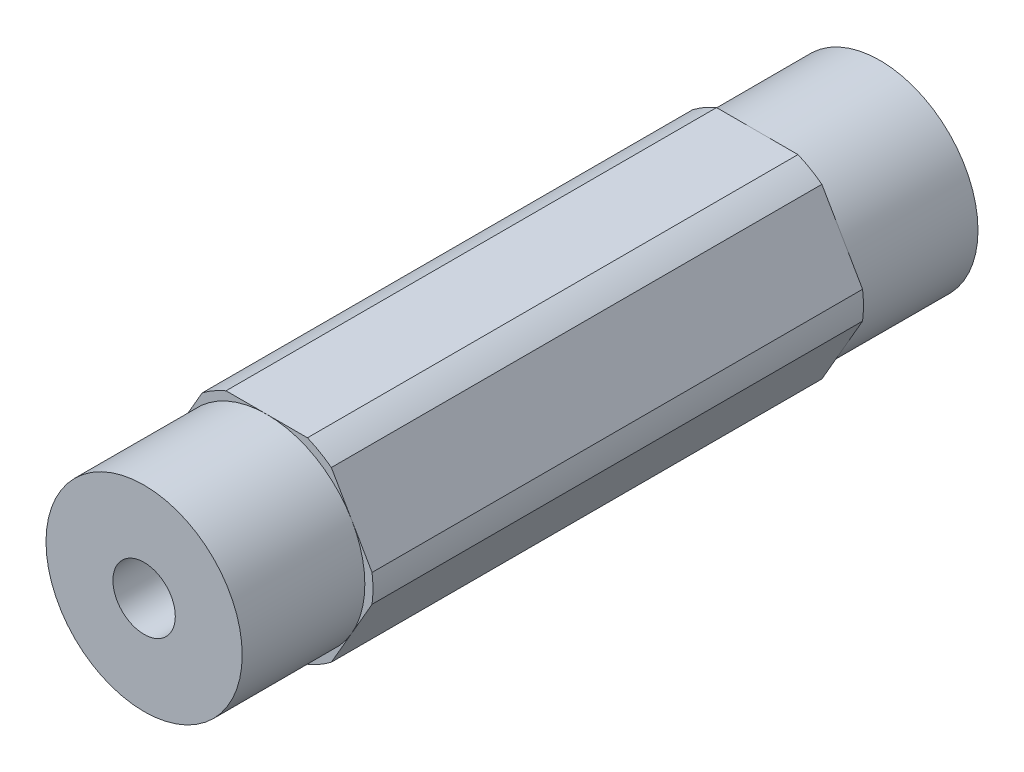
ISO-10303-21;
HEADER;
FILE_DESCRIPTION(('STEP AP214'),'2;1');
FILE_NAME('part.step','',(''),(''),'','','');
FILE_SCHEMA(('AUTOMOTIVE_DESIGN { 1 0 10303 214 1 1 1 1 }'));
ENDSEC;
DATA;
#1=APPLICATION_CONTEXT('core data for automotive mechanical design processes');
#2=APPLICATION_PROTOCOL_DEFINITION('international standard','automotive_design',2000,#1);
#3=PRODUCT_CONTEXT('',#1,'mechanical');
#4=PRODUCT('Part','Part','',(#3));
#5=PRODUCT_RELATED_PRODUCT_CATEGORY('part','',(#4));
#6=PRODUCT_DEFINITION_FORMATION('','',#4);
#7=PRODUCT_DEFINITION_CONTEXT('part definition',#1,'design');
#8=PRODUCT_DEFINITION('design','',#6,#7);
#9=PRODUCT_DEFINITION_SHAPE('','',#8);
#10=(LENGTH_UNIT() NAMED_UNIT(*) SI_UNIT(.MILLI.,.METRE.));
#11=(NAMED_UNIT(*) PLANE_ANGLE_UNIT() SI_UNIT($,.RADIAN.));
#12=(NAMED_UNIT(*) SI_UNIT($,.STERADIAN.) SOLID_ANGLE_UNIT());
#13=UNCERTAINTY_MEASURE_WITH_UNIT(LENGTH_MEASURE(1.E-05),#10,'distance_accuracy_value','');
#14=(GEOMETRIC_REPRESENTATION_CONTEXT(3) GLOBAL_UNCERTAINTY_ASSIGNED_CONTEXT((#13)) GLOBAL_UNIT_ASSIGNED_CONTEXT((#10,
#11,#12)) REPRESENTATION_CONTEXT('',''));
#15=CARTESIAN_POINT('',(0.,0.,0.));
#16=DIRECTION('',(0.,0.,1.));
#17=DIRECTION('',(1.,0.,0.));
#18=AXIS2_PLACEMENT_3D('',#15,#16,#17);
#19=CARTESIAN_POINT('',(5.58474434298441,3.22435364977729,23.8125));
#20=DIRECTION('',(-0.866025403784439,-0.5,0.));
#21=DIRECTION('',(0.5,-0.866025403784439,0.));
#22=AXIS2_PLACEMENT_3D('',#19,#20,#21);
#23=PLANE('',#22);
#24=DIRECTION('',(0.5,-0.866025403784439,0.));
#25=VECTOR('',#24,1.);
#26=CARTESIAN_POINT('',(5.58474434298441,3.22435364977729,-15.875));
#27=LINE('',#26,#25);
#28=CARTESIAN_POINT('',(15.2942708460865,-13.5930395710322,-15.875));
#29=VERTEX_POINT('',#28);
#30=CARTESIAN_POINT('',(16.6117613140312,-15.875,-15.875));
#31=VERTEX_POINT('',#30);
#32=EDGE_CURVE('E167',#29,#31,#27,.T.);
#33=ORIENTED_EDGE('',*,*,#32,.F.);
#34=DIRECTION('',(0.,0.,-1.));
#35=VECTOR('',#34,1.);
#36=CARTESIAN_POINT('',(15.2942708460865,-13.5930395710322,23.8125));
#37=LINE('',#36,#35);
#38=CARTESIAN_POINT('',(15.2942708460865,-13.5930395710322,15.875));
#39=VERTEX_POINT('',#38);
#40=EDGE_CURVE('E291',#39,#29,#37,.T.);
#41=ORIENTED_EDGE('',*,*,#40,.F.);
#42=DIRECTION('',(-0.5,0.866025403784439,0.));
#43=VECTOR('',#42,1.);
#44=CARTESIAN_POINT('',(5.58474434298441,3.22435364977729,15.875));
#45=LINE('',#44,#43);
#46=CARTESIAN_POINT('',(16.6117613140312,-15.875,15.875));
#47=VERTEX_POINT('',#46);
#48=EDGE_CURVE('E251',#47,#39,#45,.T.);
#49=ORIENTED_EDGE('',*,*,#48,.F.);
#50=CARTESIAN_POINT('',(17.9292517819758,-18.1569604289678,15.875));
#51=VERTEX_POINT('',#50);
#52=EDGE_CURVE('E253',#51,#47,#45,.T.);
#53=ORIENTED_EDGE('',*,*,#52,.F.);
#54=DIRECTION('',(0.,0.,-1.));
#55=VECTOR('',#54,1.);
#56=CARTESIAN_POINT('',(17.9292517819758,-18.1569604289678,23.8125));
#57=LINE('',#56,#55);
#58=CARTESIAN_POINT('',(17.9292517819758,-18.1569604289678,-15.875));
#59=VERTEX_POINT('',#58);
#60=EDGE_CURVE('E198',#51,#59,#57,.T.);
#61=ORIENTED_EDGE('',*,*,#60,.T.);
#62=EDGE_CURVE('E55',#31,#59,#27,.T.);
#63=ORIENTED_EDGE('',*,*,#62,.F.);
#64=EDGE_LOOP('',(#33,#41,#49,#53,#61,#63));
#65=FACE_BOUND('',#64,.T.);
#66=ADVANCED_FACE('F41',(#65),#23,.F.);
#67=CARTESIAN_POINT('',(11.1125,-19.05,23.8125));
#68=DIRECTION('',(0.,0.,-1.));
#69=DIRECTION('',(-1.,0.,0.));
#70=AXIS2_PLACEMENT_3D('',#67,#68,#69);
#71=CYLINDRICAL_SURFACE('',#70,6.874999966);
#72=CARTESIAN_POINT('',(11.1125,-19.05,-15.875));
#73=DIRECTION('',(0.,0.,-1.));
#74=DIRECTION('',(-1.,0.,0.));
#75=AXIS2_PLACEMENT_3D('',#72,#73,#74);
#76=CIRCLE('',#75,6.874999966);
#77=CARTESIAN_POINT('',(13.7474809358893,-12.7,-15.875));
#78=VERTEX_POINT('',#77);
#79=EDGE_CURVE('E173',#78,#29,#76,.T.);
#80=ORIENTED_EDGE('',*,*,#79,.F.);
#81=DIRECTION('',(0.,0.,-1.));
#82=VECTOR('',#81,1.);
#83=CARTESIAN_POINT('',(13.7474809358893,-12.7,23.8125));
#84=LINE('',#83,#82);
#85=CARTESIAN_POINT('',(13.7474809358893,-12.7,15.875));
#86=VERTEX_POINT('',#85);
#87=EDGE_CURVE('E288',#86,#78,#84,.T.);
#88=ORIENTED_EDGE('',*,*,#87,.F.);
#89=CARTESIAN_POINT('',(11.1125,-19.05,15.875));
#90=DIRECTION('',(0.,0.,1.));
#91=DIRECTION('',(1.,0.,0.));
#92=AXIS2_PLACEMENT_3D('',#89,#90,#91);
#93=CIRCLE('',#92,6.874999966);
#94=EDGE_CURVE('E249',#39,#86,#93,.T.);
#95=ORIENTED_EDGE('',*,*,#94,.F.);
#96=ORIENTED_EDGE('',*,*,#40,.T.);
#97=EDGE_LOOP('',(#80,#88,#95,#96));
#98=FACE_BOUND('',#97,.T.);
#99=ADVANCED_FACE('F310',(#98),#71,.T.);
#100=CARTESIAN_POINT('',(0.,-12.7,23.8125));
#101=DIRECTION('',(0.,-1.,0.));
#102=DIRECTION('',(0.,0.,-1.));
#103=AXIS2_PLACEMENT_3D('',#100,#101,#102);
#104=PLANE('',#103);
#105=DIRECTION('',(1.,0.,0.));
#106=VECTOR('',#105,1.);
#107=CARTESIAN_POINT('',(0.,-12.7,-15.875));
#108=LINE('',#107,#106);
#109=CARTESIAN_POINT('',(8.4775190641107,-12.7,-15.875));
#110=VERTEX_POINT('',#109);
#111=CARTESIAN_POINT('',(11.1125,-12.7,-15.875));
#112=VERTEX_POINT('',#111);
#113=EDGE_CURVE('E214',#110,#112,#108,.T.);
#114=ORIENTED_EDGE('',*,*,#113,.F.);
#115=DIRECTION('',(0.,0.,-1.));
#116=VECTOR('',#115,1.);
#117=CARTESIAN_POINT('',(8.4775190641107,-12.7,23.8125));
#118=LINE('',#117,#116);
#119=CARTESIAN_POINT('',(8.4775190641107,-12.7,15.875));
#120=VERTEX_POINT('',#119);
#121=EDGE_CURVE('E285',#120,#110,#118,.T.);
#122=ORIENTED_EDGE('',*,*,#121,.F.);
#123=DIRECTION('',(-1.,0.,0.));
#124=VECTOR('',#123,1.);
#125=CARTESIAN_POINT('',(0.,-12.7,15.875));
#126=LINE('',#125,#124);
#127=CARTESIAN_POINT('',(11.1125,-12.7,15.875));
#128=VERTEX_POINT('',#127);
#129=EDGE_CURVE('E246',#128,#120,#126,.T.);
#130=ORIENTED_EDGE('',*,*,#129,.F.);
#131=EDGE_CURVE('E248',#86,#128,#126,.T.);
#132=ORIENTED_EDGE('',*,*,#131,.F.);
#133=ORIENTED_EDGE('',*,*,#87,.T.);
#134=EDGE_CURVE('E211',#112,#78,#108,.T.);
#135=ORIENTED_EDGE('',*,*,#134,.F.);
#136=EDGE_LOOP('',(#114,#122,#130,#132,#133,#135));
#137=FACE_BOUND('',#136,.T.);
#138=ADVANCED_FACE('F314',(#137),#104,.F.);
#139=CARTESIAN_POINT('',(11.1125,-19.05,-15.875));
#140=DIRECTION('',(0.,0.,-1.));
#141=DIRECTION('',(-1.,0.,0.));
#142=AXIS2_PLACEMENT_3D('',#139,#140,#141);
#143=CIRCLE('',#142,6.874999966);
#144=CARTESIAN_POINT('',(6.93072915391346,-13.5930395710322,-15.875));
#145=VERTEX_POINT('',#144);
#146=EDGE_CURVE('E219',#145,#110,#143,.T.);
#147=ORIENTED_EDGE('',*,*,#146,.F.);
#148=DIRECTION('',(0.,0.,-1.));
#149=VECTOR('',#148,1.);
#150=CARTESIAN_POINT('',(6.93072915391346,-13.5930395710322,23.8125));
#151=LINE('',#150,#149);
#152=CARTESIAN_POINT('',(6.93072915391346,-13.5930395710322,15.875));
#153=VERTEX_POINT('',#152);
#154=EDGE_CURVE('E282',#153,#145,#151,.T.);
#155=ORIENTED_EDGE('',*,*,#154,.F.);
#156=CARTESIAN_POINT('',(11.1125,-19.05,15.875));
#157=DIRECTION('',(0.,0.,1.));
#158=DIRECTION('',(1.,0.,0.));
#159=AXIS2_PLACEMENT_3D('',#156,#157,#158);
#160=CIRCLE('',#159,6.874999966);
#161=EDGE_CURVE('E244',#120,#153,#160,.T.);
#162=ORIENTED_EDGE('',*,*,#161,.F.);
#163=ORIENTED_EDGE('',*,*,#121,.T.);
#164=EDGE_LOOP('',(#147,#155,#162,#163));
#165=FACE_BOUND('',#164,.T.);
#166=ADVANCED_FACE('F317',(#165),#71,.T.);
#167=CARTESIAN_POINT('',(11.0840056570156,-6.39935364977728,23.8125));
#168=DIRECTION('',(0.866025403784439,-0.5,0.));
#169=DIRECTION('',(0.5,0.866025403784439,0.));
#170=AXIS2_PLACEMENT_3D('',#167,#168,#169);
#171=PLANE('',#170);
#172=DIRECTION('',(0.5,0.866025403784439,0.));
#173=VECTOR('',#172,1.);
#174=CARTESIAN_POINT('',(11.0840056570156,-6.39935364977728,-15.875));
#175=LINE('',#174,#173);
#176=CARTESIAN_POINT('',(4.29574821802417,-18.1569604289678,-15.875));
#177=VERTEX_POINT('',#176);
#178=CARTESIAN_POINT('',(5.61323868596881,-15.875,-15.875));
#179=VERTEX_POINT('',#178);
#180=EDGE_CURVE('E217',#177,#179,#175,.T.);
#181=ORIENTED_EDGE('',*,*,#180,.F.);
#182=DIRECTION('',(0.,0.,-1.));
#183=VECTOR('',#182,1.);
#184=CARTESIAN_POINT('',(4.29574821802417,-18.1569604289678,23.8125));
#185=LINE('',#184,#183);
#186=CARTESIAN_POINT('',(4.29574821802417,-18.1569604289678,15.875));
#187=VERTEX_POINT('',#186);
#188=EDGE_CURVE('E279',#187,#177,#185,.T.);
#189=ORIENTED_EDGE('',*,*,#188,.F.);
#190=DIRECTION('',(-0.5,-0.866025403784439,0.));
#191=VECTOR('',#190,1.);
#192=CARTESIAN_POINT('',(11.0840056570156,-6.39935364977728,15.875));
#193=LINE('',#192,#191);
#194=CARTESIAN_POINT('',(5.61323868596881,-15.875,15.875));
#195=VERTEX_POINT('',#194);
#196=EDGE_CURVE('E241',#195,#187,#193,.T.);
#197=ORIENTED_EDGE('',*,*,#196,.F.);
#198=EDGE_CURVE('E243',#153,#195,#193,.T.);
#199=ORIENTED_EDGE('',*,*,#198,.F.);
#200=ORIENTED_EDGE('',*,*,#154,.T.);
#201=EDGE_CURVE('E220',#179,#145,#175,.T.);
#202=ORIENTED_EDGE('',*,*,#201,.F.);
#203=EDGE_LOOP('',(#181,#189,#197,#199,#200,#202));
#204=FACE_BOUND('',#203,.T.);
#205=ADVANCED_FACE('F323',(#204),#171,.F.);
#206=CARTESIAN_POINT('',(11.1125,-19.05,-15.875));
#207=DIRECTION('',(0.,0.,-1.));
#208=DIRECTION('',(-1.,0.,0.));
#209=AXIS2_PLACEMENT_3D('',#206,#207,#208);
#210=CIRCLE('',#209,6.874999966);
#211=CARTESIAN_POINT('',(4.29574821802416,-19.9430395710322,-15.875));
#212=VERTEX_POINT('',#211);
#213=EDGE_CURVE('E215',#212,#177,#210,.T.);
#214=ORIENTED_EDGE('',*,*,#213,.F.);
#215=DIRECTION('',(0.,0.,-1.));
#216=VECTOR('',#215,1.);
#217=CARTESIAN_POINT('',(4.29574821802417,-19.9430395710322,23.8125));
#218=LINE('',#217,#216);
#219=CARTESIAN_POINT('',(4.29574821802416,-19.9430395710322,15.875));
#220=VERTEX_POINT('',#219);
#221=EDGE_CURVE('E276',#220,#212,#218,.T.);
#222=ORIENTED_EDGE('',*,*,#221,.F.);
#223=CARTESIAN_POINT('',(11.1125,-19.05,15.875));
#224=DIRECTION('',(0.,0.,1.));
#225=DIRECTION('',(1.,0.,0.));
#226=AXIS2_PLACEMENT_3D('',#223,#224,#225);
#227=CIRCLE('',#226,6.874999966);
#228=EDGE_CURVE('E239',#187,#220,#227,.T.);
#229=ORIENTED_EDGE('',*,*,#228,.F.);
#230=ORIENTED_EDGE('',*,*,#188,.T.);
#231=EDGE_LOOP('',(#214,#222,#229,#230));
#232=FACE_BOUND('',#231,.T.);
#233=ADVANCED_FACE('F326',(#232),#71,.T.);
#234=CARTESIAN_POINT('',(-5.41377828507796,-3.12564635022271,23.8125));
#235=DIRECTION('',(0.866025403784439,0.5,0.));
#236=DIRECTION('',(-0.5,0.866025403784439,0.));
#237=AXIS2_PLACEMENT_3D('',#234,#235,#236);
#238=PLANE('',#237);
#239=DIRECTION('',(-0.5,0.866025403784439,0.));
#240=VECTOR('',#239,1.);
#241=CARTESIAN_POINT('',(-5.41377828507796,-3.12564635022271,-15.875));
#242=LINE('',#241,#240);
#243=CARTESIAN_POINT('',(6.93072915391346,-24.5069604289678,-15.875));
#244=VERTEX_POINT('',#243);
#245=CARTESIAN_POINT('',(5.61323868596881,-22.225,-15.875));
#246=VERTEX_POINT('',#245);
#247=EDGE_CURVE('E209',#244,#246,#242,.T.);
#248=ORIENTED_EDGE('',*,*,#247,.F.);
#249=DIRECTION('',(0.,0.,-1.));
#250=VECTOR('',#249,1.);
#251=CARTESIAN_POINT('',(6.93072915391346,-24.5069604289678,23.8125));
#252=LINE('',#251,#250);
#253=CARTESIAN_POINT('',(6.93072915391346,-24.5069604289678,15.875));
#254=VERTEX_POINT('',#253);
#255=EDGE_CURVE('E273',#254,#244,#252,.T.);
#256=ORIENTED_EDGE('',*,*,#255,.F.);
#257=DIRECTION('',(0.5,-0.866025403784439,0.));
#258=VECTOR('',#257,1.);
#259=CARTESIAN_POINT('',(-5.41377828507796,-3.12564635022271,15.875));
#260=LINE('',#259,#258);
#261=CARTESIAN_POINT('',(5.61323868596881,-22.225,15.875));
#262=VERTEX_POINT('',#261);
#263=EDGE_CURVE('E236',#262,#254,#260,.T.);
#264=ORIENTED_EDGE('',*,*,#263,.F.);
#265=EDGE_CURVE('E238',#220,#262,#260,.T.);
#266=ORIENTED_EDGE('',*,*,#265,.F.);
#267=ORIENTED_EDGE('',*,*,#221,.T.);
#268=EDGE_CURVE('E212',#246,#212,#242,.T.);
#269=ORIENTED_EDGE('',*,*,#268,.F.);
#270=EDGE_LOOP('',(#248,#256,#264,#266,#267,#269));
#271=FACE_BOUND('',#270,.T.);
#272=ADVANCED_FACE('F328',(#271),#238,.F.);
#273=CARTESIAN_POINT('',(11.1125,-19.05,-15.875));
#274=DIRECTION('',(0.,0.,-1.));
#275=DIRECTION('',(-1.,0.,0.));
#276=AXIS2_PLACEMENT_3D('',#273,#274,#275);
#277=CIRCLE('',#276,6.874999966);
#278=CARTESIAN_POINT('',(8.47751906411071,-25.4,-15.875));
#279=VERTEX_POINT('',#278);
#280=EDGE_CURVE('E207',#279,#244,#277,.T.);
#281=ORIENTED_EDGE('',*,*,#280,.F.);
#282=DIRECTION('',(0.,0.,-1.));
#283=VECTOR('',#282,1.);
#284=CARTESIAN_POINT('',(8.47751906411071,-25.4,23.8125));
#285=LINE('',#284,#283);
#286=CARTESIAN_POINT('',(8.47751906411071,-25.4,15.875));
#287=VERTEX_POINT('',#286);
#288=EDGE_CURVE('E270',#287,#279,#285,.T.);
#289=ORIENTED_EDGE('',*,*,#288,.F.);
#290=CARTESIAN_POINT('',(11.1125,-19.05,15.875));
#291=DIRECTION('',(0.,0.,1.));
#292=DIRECTION('',(1.,0.,0.));
#293=AXIS2_PLACEMENT_3D('',#290,#291,#292);
#294=CIRCLE('',#293,6.874999966);
#295=EDGE_CURVE('E234',#254,#287,#294,.T.);
#296=ORIENTED_EDGE('',*,*,#295,.F.);
#297=ORIENTED_EDGE('',*,*,#255,.T.);
#298=EDGE_LOOP('',(#281,#289,#296,#297));
#299=FACE_BOUND('',#298,.T.);
#300=ADVANCED_FACE('F331',(#299),#71,.T.);
#301=CARTESIAN_POINT('',(0.,-25.4,23.8125));
#302=DIRECTION('',(0.,1.,0.));
#303=DIRECTION('',(0.,0.,1.));
#304=AXIS2_PLACEMENT_3D('',#301,#302,#303);
#305=PLANE('',#304);
#306=DIRECTION('',(-1.,0.,0.));
#307=VECTOR('',#306,1.);
#308=CARTESIAN_POINT('',(0.,-25.4,-15.875));
#309=LINE('',#308,#307);
#310=CARTESIAN_POINT('',(13.7474809358893,-25.4,-15.875));
#311=VERTEX_POINT('',#310);
#312=CARTESIAN_POINT('',(11.1125,-25.4,-15.875));
#313=VERTEX_POINT('',#312);
#314=EDGE_CURVE('E203',#311,#313,#309,.T.);
#315=ORIENTED_EDGE('',*,*,#314,.F.);
#316=DIRECTION('',(0.,0.,-1.));
#317=VECTOR('',#316,1.);
#318=CARTESIAN_POINT('',(13.7474809358893,-25.4,23.8125));
#319=LINE('',#318,#317);
#320=CARTESIAN_POINT('',(13.7474809358893,-25.4,15.875));
#321=VERTEX_POINT('',#320);
#322=EDGE_CURVE('E267',#321,#311,#319,.T.);
#323=ORIENTED_EDGE('',*,*,#322,.F.);
#324=DIRECTION('',(1.,0.,0.));
#325=VECTOR('',#324,1.);
#326=CARTESIAN_POINT('',(0.,-25.4,15.875));
#327=LINE('',#326,#325);
#328=CARTESIAN_POINT('',(11.1125,-25.4,15.875));
#329=VERTEX_POINT('',#328);
#330=EDGE_CURVE('E231',#329,#321,#327,.T.);
#331=ORIENTED_EDGE('',*,*,#330,.F.);
#332=EDGE_CURVE('E233',#287,#329,#327,.T.);
#333=ORIENTED_EDGE('',*,*,#332,.F.);
#334=ORIENTED_EDGE('',*,*,#288,.T.);
#335=EDGE_CURVE('E205',#313,#279,#309,.T.);
#336=ORIENTED_EDGE('',*,*,#335,.F.);
#337=EDGE_LOOP('',(#315,#323,#331,#333,#334,#336));
#338=FACE_BOUND('',#337,.T.);
#339=ADVANCED_FACE('F333',(#338),#305,.F.);
#340=CARTESIAN_POINT('',(11.1125,-19.05,-15.875));
#341=DIRECTION('',(0.,0.,-1.));
#342=DIRECTION('',(-1.,0.,0.));
#343=AXIS2_PLACEMENT_3D('',#340,#341,#342);
#344=CIRCLE('',#343,6.874999966);
#345=CARTESIAN_POINT('',(15.2942708460865,-24.5069604289678,-15.875));
#346=VERTEX_POINT('',#345);
#347=EDGE_CURVE('E201',#346,#311,#344,.T.);
#348=ORIENTED_EDGE('',*,*,#347,.F.);
#349=DIRECTION('',(0.,0.,-1.));
#350=VECTOR('',#349,1.);
#351=CARTESIAN_POINT('',(15.2942708460866,-24.5069604289678,23.8125));
#352=LINE('',#351,#350);
#353=CARTESIAN_POINT('',(15.2942708460865,-24.5069604289678,15.875));
#354=VERTEX_POINT('',#353);
#355=EDGE_CURVE('E264',#354,#346,#352,.T.);
#356=ORIENTED_EDGE('',*,*,#355,.F.);
#357=CARTESIAN_POINT('',(11.1125,-19.05,15.875));
#358=DIRECTION('',(0.,0.,1.));
#359=DIRECTION('',(1.,0.,0.));
#360=AXIS2_PLACEMENT_3D('',#357,#358,#359);
#361=CIRCLE('',#360,6.874999966);
#362=EDGE_CURVE('E229',#321,#354,#361,.T.);
#363=ORIENTED_EDGE('',*,*,#362,.F.);
#364=ORIENTED_EDGE('',*,*,#322,.T.);
#365=EDGE_LOOP('',(#348,#356,#363,#364));
#366=FACE_BOUND('',#365,.T.);
#367=ADVANCED_FACE('F336',(#366),#71,.T.);
#368=CARTESIAN_POINT('',(22.082528285078,-12.7493536497773,23.8125));
#369=DIRECTION('',(-0.866025403784439,0.499999999999999,0.));
#370=DIRECTION('',(-0.499999999999999,-0.866025403784439,0.));
#371=AXIS2_PLACEMENT_3D('',#368,#369,#370);
#372=PLANE('',#371);
#373=DIRECTION('',(-0.499999999999999,-0.866025403784439,0.));
#374=VECTOR('',#373,1.);
#375=CARTESIAN_POINT('',(22.082528285078,-12.7493536497773,-15.875));
#376=LINE('',#375,#374);
#377=CARTESIAN_POINT('',(17.9292517819758,-19.9430395710322,-15.875));
#378=VERTEX_POINT('',#377);
#379=CARTESIAN_POINT('',(16.6117613140312,-22.225,-15.875));
#380=VERTEX_POINT('',#379);
#381=EDGE_CURVE('E183',#378,#380,#376,.T.);
#382=ORIENTED_EDGE('',*,*,#381,.F.);
#383=DIRECTION('',(0.,0.,-1.));
#384=VECTOR('',#383,1.);
#385=CARTESIAN_POINT('',(17.9292517819758,-19.9430395710322,23.8125));
#386=LINE('',#385,#384);
#387=CARTESIAN_POINT('',(17.9292517819758,-19.9430395710322,15.875));
#388=VERTEX_POINT('',#387);
#389=EDGE_CURVE('E261',#388,#378,#386,.T.);
#390=ORIENTED_EDGE('',*,*,#389,.F.);
#391=DIRECTION('',(0.499999999999999,0.866025403784439,0.));
#392=VECTOR('',#391,1.);
#393=CARTESIAN_POINT('',(22.082528285078,-12.7493536497773,15.875));
#394=LINE('',#393,#392);
#395=CARTESIAN_POINT('',(16.6117613140312,-22.225,15.875));
#396=VERTEX_POINT('',#395);
#397=EDGE_CURVE('E63',#396,#388,#394,.T.);
#398=ORIENTED_EDGE('',*,*,#397,.F.);
#399=EDGE_CURVE('E228',#354,#396,#394,.T.);
#400=ORIENTED_EDGE('',*,*,#399,.F.);
#401=ORIENTED_EDGE('',*,*,#355,.T.);
#402=EDGE_CURVE('E177',#380,#346,#376,.T.);
#403=ORIENTED_EDGE('',*,*,#402,.F.);
#404=EDGE_LOOP('',(#382,#390,#398,#400,#401,#403));
#405=FACE_BOUND('',#404,.T.);
#406=ADVANCED_FACE('F338',(#405),#372,.F.);
#407=CARTESIAN_POINT('',(11.1125,-19.05,-15.875));
#408=DIRECTION('',(0.,0.,-1.));
#409=DIRECTION('',(-1.,0.,0.));
#410=AXIS2_PLACEMENT_3D('',#407,#408,#409);
#411=CIRCLE('',#410,6.874999966);
#412=EDGE_CURVE('E12',#59,#378,#411,.T.);
#413=ORIENTED_EDGE('',*,*,#412,.F.);
#414=ORIENTED_EDGE('',*,*,#60,.F.);
#415=CARTESIAN_POINT('',(11.1125,-19.05,15.875));
#416=DIRECTION('',(0.,0.,1.));
#417=DIRECTION('',(1.,0.,0.));
#418=AXIS2_PLACEMENT_3D('',#415,#416,#417);
#419=CIRCLE('',#418,6.874999966);
#420=EDGE_CURVE('E296',#388,#51,#419,.T.);
#421=ORIENTED_EDGE('',*,*,#420,.F.);
#422=ORIENTED_EDGE('',*,*,#389,.T.);
#423=EDGE_LOOP('',(#413,#414,#421,#422));
#424=FACE_BOUND('',#423,.T.);
#425=ADVANCED_FACE('F318',(#424),#71,.T.);
#426=CARTESIAN_POINT('',(0.,0.,-23.8125));
#427=DIRECTION('',(0.,0.,1.));
#428=DIRECTION('',(1.,0.,0.));
#429=AXIS2_PLACEMENT_3D('',#426,#427,#428);
#430=PLANE('',#429);
#431=CARTESIAN_POINT('',(11.1125,-19.05,-23.8125));
#432=DIRECTION('',(0.,0.,1.));
#433=DIRECTION('',(1.,0.,0.));
#434=AXIS2_PLACEMENT_3D('',#431,#432,#433);
#435=CIRCLE('',#434,2.0193);
#436=CARTESIAN_POINT('',(13.1318,-19.05,-23.8125));
#437=VERTEX_POINT('',#436);
#438=EDGE_CURVE('E257',#437,#437,#435,.T.);
#439=ORIENTED_EDGE('',*,*,#438,.T.);
#440=EDGE_LOOP('',(#439));
#441=FACE_BOUND('',#440,.T.);
#442=CARTESIAN_POINT('',(11.1125,-19.05,-23.8125));
#443=DIRECTION('',(0.,0.,1.));
#444=DIRECTION('',(1.,0.,0.));
#445=AXIS2_PLACEMENT_3D('',#442,#443,#444);
#446=CIRCLE('',#445,6.35);
#447=CARTESIAN_POINT('',(17.4625,-19.05,-23.8125));
#448=VERTEX_POINT('',#447);
#449=EDGE_CURVE('E49',#448,#448,#446,.F.);
#450=ORIENTED_EDGE('',*,*,#449,.T.);
#451=EDGE_LOOP('',(#450));
#452=FACE_BOUND('',#451,.T.);
#453=ADVANCED_FACE('F300',(#441,#452),#430,.F.);
#454=CARTESIAN_POINT('',(0.,0.,23.8125));
#455=DIRECTION('',(0.,0.,1.));
#456=DIRECTION('',(1.,0.,0.));
#457=AXIS2_PLACEMENT_3D('',#454,#455,#456);
#458=PLANE('',#457);
#459=CARTESIAN_POINT('',(11.1125,-19.05,23.8125));
#460=DIRECTION('',(0.,0.,1.));
#461=DIRECTION('',(1.,0.,0.));
#462=AXIS2_PLACEMENT_3D('',#459,#460,#461);
#463=CIRCLE('',#462,2.0193);
#464=CARTESIAN_POINT('',(13.1318,-19.05,23.8125));
#465=VERTEX_POINT('',#464);
#466=EDGE_CURVE('E254',#465,#465,#463,.T.);
#467=ORIENTED_EDGE('',*,*,#466,.F.);
#468=EDGE_LOOP('',(#467));
#469=FACE_BOUND('',#468,.T.);
#470=CARTESIAN_POINT('',(11.1125,-19.05,23.8125));
#471=DIRECTION('',(0.,0.,1.));
#472=DIRECTION('',(1.,0.,0.));
#473=AXIS2_PLACEMENT_3D('',#470,#471,#472);
#474=CIRCLE('',#473,6.35);
#475=CARTESIAN_POINT('',(17.4625,-19.05,23.8125));
#476=VERTEX_POINT('',#475);
#477=EDGE_CURVE('E293',#476,#476,#474,.T.);
#478=ORIENTED_EDGE('',*,*,#477,.T.);
#479=EDGE_LOOP('',(#478));
#480=FACE_BOUND('',#479,.T.);
#481=ADVANCED_FACE('F344',(#469,#480),#458,.T.);
#482=CARTESIAN_POINT('',(11.1125,-19.05,23.8125));
#483=DIRECTION('',(0.,0.,-1.));
#484=DIRECTION('',(-1.,0.,0.));
#485=AXIS2_PLACEMENT_3D('',#482,#483,#484);
#486=CYLINDRICAL_SURFACE('',#485,2.0193);
#487=ORIENTED_EDGE('',*,*,#466,.T.);
#488=EDGE_LOOP('',(#487));
#489=FACE_BOUND('',#488,.T.);
#490=ORIENTED_EDGE('',*,*,#438,.F.);
#491=EDGE_LOOP('',(#490));
#492=FACE_BOUND('',#491,.T.);
#493=ADVANCED_FACE('F43',(#489,#492),#486,.F.);
#494=CARTESIAN_POINT('',(11.1125,-19.05,15.875));
#495=DIRECTION('',(0.,0.,1.));
#496=DIRECTION('',(1.,0.,0.));
#497=AXIS2_PLACEMENT_3D('',#494,#495,#496);
#498=PLANE('',#497);
#499=ORIENTED_EDGE('',*,*,#52,.T.);
#500=CARTESIAN_POINT('',(11.1125,-19.05,15.875));
#501=DIRECTION('',(0.,0.,1.));
#502=DIRECTION('',(1.,0.,0.));
#503=AXIS2_PLACEMENT_3D('',#500,#501,#502);
#504=CIRCLE('',#503,6.35);
#505=EDGE_CURVE('E226',#396,#47,#504,.T.);
#506=ORIENTED_EDGE('',*,*,#505,.F.);
#507=ORIENTED_EDGE('',*,*,#397,.T.);
#508=ORIENTED_EDGE('',*,*,#420,.T.);
#509=EDGE_LOOP('',(#499,#506,#507,#508));
#510=FACE_BOUND('',#509,.T.);
#511=ADVANCED_FACE('F349',(#510),#498,.T.);
#512=ORIENTED_EDGE('',*,*,#48,.T.);
#513=ORIENTED_EDGE('',*,*,#94,.T.);
#514=ORIENTED_EDGE('',*,*,#131,.T.);
#515=EDGE_CURVE('E222',#47,#128,#504,.T.);
#516=ORIENTED_EDGE('',*,*,#515,.F.);
#517=EDGE_LOOP('',(#512,#513,#514,#516));
#518=FACE_BOUND('',#517,.T.);
#519=ADVANCED_FACE('F352',(#518),#498,.T.);
#520=ORIENTED_EDGE('',*,*,#129,.T.);
#521=ORIENTED_EDGE('',*,*,#161,.T.);
#522=ORIENTED_EDGE('',*,*,#198,.T.);
#523=EDGE_CURVE('E225',#128,#195,#504,.T.);
#524=ORIENTED_EDGE('',*,*,#523,.F.);
#525=EDGE_LOOP('',(#520,#521,#522,#524));
#526=FACE_BOUND('',#525,.T.);
#527=ADVANCED_FACE('F378',(#526),#498,.T.);
#528=ORIENTED_EDGE('',*,*,#196,.T.);
#529=ORIENTED_EDGE('',*,*,#228,.T.);
#530=ORIENTED_EDGE('',*,*,#265,.T.);
#531=EDGE_CURVE('E382',#195,#262,#504,.T.);
#532=ORIENTED_EDGE('',*,*,#531,.F.);
#533=EDGE_LOOP('',(#528,#529,#530,#532));
#534=FACE_BOUND('',#533,.T.);
#535=ADVANCED_FACE('F383',(#534),#498,.T.);
#536=ORIENTED_EDGE('',*,*,#263,.T.);
#537=ORIENTED_EDGE('',*,*,#295,.T.);
#538=ORIENTED_EDGE('',*,*,#332,.T.);
#539=EDGE_CURVE('E390',#262,#329,#504,.T.);
#540=ORIENTED_EDGE('',*,*,#539,.F.);
#541=EDGE_LOOP('',(#536,#537,#538,#540));
#542=FACE_BOUND('',#541,.T.);
#543=ADVANCED_FACE('F409',(#542),#498,.T.);
#544=ORIENTED_EDGE('',*,*,#330,.T.);
#545=ORIENTED_EDGE('',*,*,#362,.T.);
#546=ORIENTED_EDGE('',*,*,#399,.T.);
#547=EDGE_CURVE('E420',#329,#396,#504,.T.);
#548=ORIENTED_EDGE('',*,*,#547,.F.);
#549=EDGE_LOOP('',(#544,#545,#546,#548));
#550=FACE_BOUND('',#549,.T.);
#551=ADVANCED_FACE('F353',(#550),#498,.T.);
#552=CARTESIAN_POINT('',(11.1125,-19.05,15.875));
#553=DIRECTION('',(0.,0.,1.));
#554=DIRECTION('',(1.,0.,0.));
#555=AXIS2_PLACEMENT_3D('',#552,#553,#554);
#556=CYLINDRICAL_SURFACE('',#555,6.35);
#557=ORIENTED_EDGE('',*,*,#477,.F.);
#558=EDGE_LOOP('',(#557));
#559=FACE_BOUND('',#558,.T.);
#560=ORIENTED_EDGE('',*,*,#505,.T.);
#561=ORIENTED_EDGE('',*,*,#515,.T.);
#562=ORIENTED_EDGE('',*,*,#523,.T.);
#563=ORIENTED_EDGE('',*,*,#531,.T.);
#564=ORIENTED_EDGE('',*,*,#539,.T.);
#565=ORIENTED_EDGE('',*,*,#547,.T.);
#566=EDGE_LOOP('',(#560,#561,#562,#563,#564,#565));
#567=FACE_BOUND('',#566,.T.);
#568=ADVANCED_FACE('F354',(#559,#567),#556,.T.);
#569=CARTESIAN_POINT('',(11.1125,-19.05,-15.875));
#570=DIRECTION('',(0.,0.,-1.));
#571=DIRECTION('',(-1.,0.,0.));
#572=AXIS2_PLACEMENT_3D('',#569,#570,#571);
#573=PLANE('',#572);
#574=ORIENTED_EDGE('',*,*,#201,.T.);
#575=ORIENTED_EDGE('',*,*,#146,.T.);
#576=ORIENTED_EDGE('',*,*,#113,.T.);
#577=CARTESIAN_POINT('',(11.1125,-19.05,-15.875));
#578=DIRECTION('',(0.,0.,1.));
#579=DIRECTION('',(1.,0.,0.));
#580=AXIS2_PLACEMENT_3D('',#577,#578,#579);
#581=CIRCLE('',#580,6.35);
#582=EDGE_CURVE('E194',#112,#179,#581,.T.);
#583=ORIENTED_EDGE('',*,*,#582,.T.);
#584=EDGE_LOOP('',(#574,#575,#576,#583));
#585=FACE_BOUND('',#584,.T.);
#586=ADVANCED_FACE('F308',(#585),#573,.T.);
#587=ORIENTED_EDGE('',*,*,#180,.T.);
#588=EDGE_CURVE('E402',#179,#246,#581,.T.);
#589=ORIENTED_EDGE('',*,*,#588,.T.);
#590=ORIENTED_EDGE('',*,*,#268,.T.);
#591=ORIENTED_EDGE('',*,*,#213,.T.);
#592=EDGE_LOOP('',(#587,#589,#590,#591));
#593=FACE_BOUND('',#592,.T.);
#594=ADVANCED_FACE('F358',(#593),#573,.T.);
#595=ORIENTED_EDGE('',*,*,#134,.T.);
#596=ORIENTED_EDGE('',*,*,#79,.T.);
#597=ORIENTED_EDGE('',*,*,#32,.T.);
#598=EDGE_CURVE('E170',#31,#112,#581,.T.);
#599=ORIENTED_EDGE('',*,*,#598,.T.);
#600=EDGE_LOOP('',(#595,#596,#597,#599));
#601=FACE_BOUND('',#600,.T.);
#602=ADVANCED_FACE('F168',(#601),#573,.T.);
#603=ORIENTED_EDGE('',*,*,#247,.T.);
#604=EDGE_CURVE('E681',#246,#313,#581,.T.);
#605=ORIENTED_EDGE('',*,*,#604,.T.);
#606=ORIENTED_EDGE('',*,*,#335,.T.);
#607=ORIENTED_EDGE('',*,*,#280,.T.);
#608=EDGE_LOOP('',(#603,#605,#606,#607));
#609=FACE_BOUND('',#608,.T.);
#610=ADVANCED_FACE('F564',(#609),#573,.T.);
#611=ORIENTED_EDGE('',*,*,#314,.T.);
#612=EDGE_CURVE('E187',#313,#380,#581,.T.);
#613=ORIENTED_EDGE('',*,*,#612,.T.);
#614=ORIENTED_EDGE('',*,*,#402,.T.);
#615=ORIENTED_EDGE('',*,*,#347,.T.);
#616=EDGE_LOOP('',(#611,#613,#614,#615));
#617=FACE_BOUND('',#616,.T.);
#618=ADVANCED_FACE('F306',(#617),#573,.T.);
#619=ORIENTED_EDGE('',*,*,#62,.T.);
#620=ORIENTED_EDGE('',*,*,#412,.T.);
#621=ORIENTED_EDGE('',*,*,#381,.T.);
#622=EDGE_CURVE('E180',#380,#31,#581,.T.);
#623=ORIENTED_EDGE('',*,*,#622,.T.);
#624=EDGE_LOOP('',(#619,#620,#621,#623));
#625=FACE_BOUND('',#624,.T.);
#626=ADVANCED_FACE('F181',(#625),#573,.T.);
#627=CARTESIAN_POINT('',(11.1125,-19.05,-15.875));
#628=DIRECTION('',(0.,0.,-1.));
#629=DIRECTION('',(-1.,0.,0.));
#630=AXIS2_PLACEMENT_3D('',#627,#628,#629);
#631=CYLINDRICAL_SURFACE('',#630,6.35);
#632=ORIENTED_EDGE('',*,*,#598,.F.);
#633=ORIENTED_EDGE('',*,*,#622,.F.);
#634=ORIENTED_EDGE('',*,*,#612,.F.);
#635=ORIENTED_EDGE('',*,*,#604,.F.);
#636=ORIENTED_EDGE('',*,*,#588,.F.);
#637=ORIENTED_EDGE('',*,*,#582,.F.);
#638=EDGE_LOOP('',(#632,#633,#634,#635,#636,#637));
#639=FACE_BOUND('',#638,.T.);
#640=ORIENTED_EDGE('',*,*,#449,.F.);
#641=EDGE_LOOP('',(#640));
#642=FACE_BOUND('',#641,.T.);
#643=ADVANCED_FACE('F190',(#639,#642),#631,.T.);
#644=CLOSED_SHELL('',(#66,#99,#138,#166,#205,#233,#272,#300,#339,#367,#406,#425,#453,#481,#493,
#511,#519,#527,#535,#543,#551,#568,#586,#594,#602,#610,#618,#626,#643));
#645=MANIFOLD_SOLID_BREP('B2',#644);
#646=ADVANCED_BREP_SHAPE_REPRESENTATION('',(#18,#645),#14);
#647=SHAPE_DEFINITION_REPRESENTATION(#9,#646);
ENDSEC;
END-ISO-10303-21;
